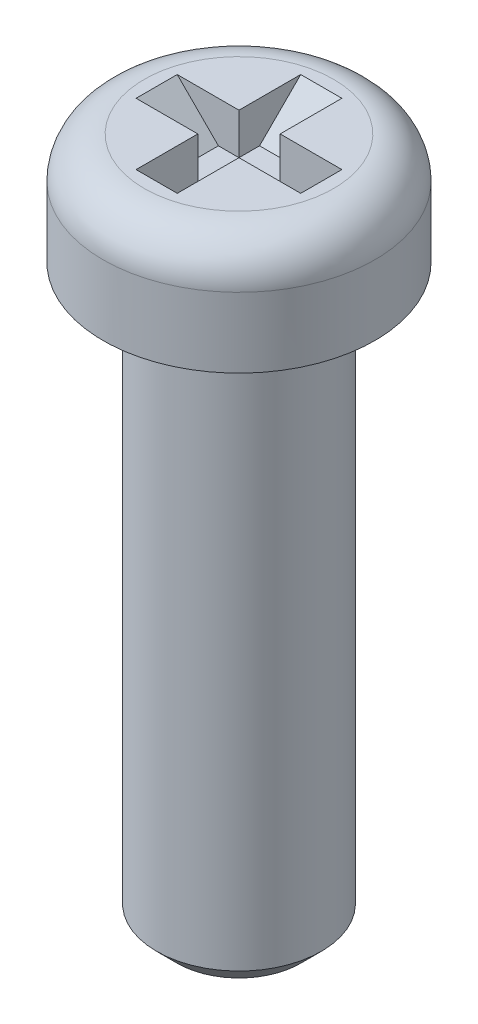
ISO-10303-21;
HEADER;
FILE_DESCRIPTION(('STEP AP214'),'2;1');
FILE_NAME('part.step','',(''),(''),'','','');
FILE_SCHEMA(('AUTOMOTIVE_DESIGN { 1 0 10303 214 1 1 1 1 }'));
ENDSEC;
DATA;
#1=APPLICATION_CONTEXT('core data for automotive mechanical design processes');
#2=APPLICATION_PROTOCOL_DEFINITION('international standard','automotive_design',2000,#1);
#3=PRODUCT_CONTEXT('',#1,'mechanical');
#4=PRODUCT('Part','Part','',(#3));
#5=PRODUCT_RELATED_PRODUCT_CATEGORY('part','',(#4));
#6=PRODUCT_DEFINITION_FORMATION('','',#4);
#7=PRODUCT_DEFINITION_CONTEXT('part definition',#1,'design');
#8=PRODUCT_DEFINITION('design','',#6,#7);
#9=PRODUCT_DEFINITION_SHAPE('','',#8);
#10=(LENGTH_UNIT() NAMED_UNIT(*) SI_UNIT(.MILLI.,.METRE.));
#11=(NAMED_UNIT(*) PLANE_ANGLE_UNIT() SI_UNIT($,.RADIAN.));
#12=(NAMED_UNIT(*) SI_UNIT($,.STERADIAN.) SOLID_ANGLE_UNIT());
#13=UNCERTAINTY_MEASURE_WITH_UNIT(LENGTH_MEASURE(1.E-05),#10,'distance_accuracy_value','');
#14=(GEOMETRIC_REPRESENTATION_CONTEXT(3) GLOBAL_UNCERTAINTY_ASSIGNED_CONTEXT((#13)) GLOBAL_UNIT_ASSIGNED_CONTEXT((#10,
#11,#12)) REPRESENTATION_CONTEXT('',''));
#15=CARTESIAN_POINT('',(0.,0.,0.));
#16=DIRECTION('',(0.,0.,1.));
#17=DIRECTION('',(1.,0.,0.));
#18=AXIS2_PLACEMENT_3D('',#15,#16,#17);
#19=CARTESIAN_POINT('',(0.,14.,0.));
#20=DIRECTION('',(0.,-1.,0.));
#21=DIRECTION('',(0.,0.,-1.));
#22=AXIS2_PLACEMENT_3D('',#19,#20,#21);
#23=CYLINDRICAL_SURFACE('',#22,2.);
#24=CARTESIAN_POINT('',(0.,0.499999999999997,0.));
#25=DIRECTION('',(0.,1.,0.));
#26=DIRECTION('',(0.,0.,1.));
#27=AXIS2_PLACEMENT_3D('',#24,#25,#26);
#28=CIRCLE('',#27,2.);
#29=CARTESIAN_POINT('',(0.,0.499999999999997,2.));
#30=VERTEX_POINT('',#29);
#31=EDGE_CURVE('E245',#30,#30,#28,.T.);
#32=ORIENTED_EDGE('',*,*,#31,.T.);
#33=EDGE_LOOP('',(#32));
#34=FACE_BOUND('',#33,.T.);
#35=CARTESIAN_POINT('',(0.,14.,0.));
#36=DIRECTION('',(0.,1.,0.));
#37=DIRECTION('',(0.,0.,1.));
#38=AXIS2_PLACEMENT_3D('',#35,#36,#37);
#39=CIRCLE('',#38,2.);
#40=CARTESIAN_POINT('',(0.,14.,2.));
#41=VERTEX_POINT('',#40);
#42=EDGE_CURVE('E231',#41,#41,#39,.T.);
#43=ORIENTED_EDGE('',*,*,#42,.F.);
#44=EDGE_LOOP('',(#43));
#45=FACE_BOUND('',#44,.T.);
#46=ADVANCED_FACE('F66',(#34,#45),#23,.T.);
#47=CARTESIAN_POINT('',(0.,0.,0.));
#48=DIRECTION('',(0.,1.,0.));
#49=DIRECTION('',(0.,0.,1.));
#50=AXIS2_PLACEMENT_3D('',#47,#48,#49);
#51=PLANE('',#50);
#52=CARTESIAN_POINT('',(0.,0.,0.));
#53=DIRECTION('',(0.,1.,0.));
#54=DIRECTION('',(0.,0.,1.));
#55=AXIS2_PLACEMENT_3D('',#52,#53,#54);
#56=CIRCLE('',#55,1.5);
#57=CARTESIAN_POINT('',(0.,0.,1.5));
#58=VERTEX_POINT('',#57);
#59=EDGE_CURVE('E244',#58,#58,#56,.F.);
#60=ORIENTED_EDGE('',*,*,#59,.T.);
#61=EDGE_LOOP('',(#60));
#62=FACE_BOUND('',#61,.T.);
#63=ADVANCED_FACE('F309',(#62),#51,.F.);
#64=CARTESIAN_POINT('',(0.,16.7,0.));
#65=DIRECTION('',(0.,-1.,0.));
#66=DIRECTION('',(0.,0.,-1.));
#67=AXIS2_PLACEMENT_3D('',#64,#65,#66);
#68=CYLINDRICAL_SURFACE('',#67,3.3);
#69=CARTESIAN_POINT('',(0.,15.7,0.));
#70=DIRECTION('',(0.,1.,0.));
#71=DIRECTION('',(0.,0.,1.));
#72=AXIS2_PLACEMENT_3D('',#69,#70,#71);
#73=CIRCLE('',#72,3.3);
#74=CARTESIAN_POINT('',(0.,15.7,-3.3));
#75=VERTEX_POINT('',#74);
#76=EDGE_CURVE('E237',#75,#75,#73,.F.);
#77=CARTESIAN_POINT('',(0.,14.,0.));
#78=DIRECTION('',(0.,1.,0.));
#79=DIRECTION('',(0.,0.,1.));
#80=AXIS2_PLACEMENT_3D('',#77,#78,#79);
#81=CIRCLE('',#80,3.3);
#82=CARTESIAN_POINT('',(0.,14.,-3.3));
#83=VERTEX_POINT('',#82);
#84=EDGE_CURVE('E220',#83,#83,#81,.T.);
#85=CARTESIAN_POINT('',(0.,15.7,-3.3));
#86=CARTESIAN_POINT('',(0.,15.6822916666667,-3.3));
#87=CARTESIAN_POINT('',(0.,15.6645833333333,-3.3));
#88=CARTESIAN_POINT('',(0.,15.6291666666667,-3.3));
#89=CARTESIAN_POINT('',(0.,15.6114583333333,-3.3));
#90=CARTESIAN_POINT('',(0.,15.5760416666667,-3.3));
#91=CARTESIAN_POINT('',(0.,15.5583333333333,-3.3));
#92=CARTESIAN_POINT('',(0.,15.5229166666667,-3.3));
#93=CARTESIAN_POINT('',(0.,15.5052083333333,-3.3));
#94=CARTESIAN_POINT('',(0.,15.4697916666667,-3.3));
#95=CARTESIAN_POINT('',(0.,15.4520833333333,-3.3));
#96=CARTESIAN_POINT('',(0.,15.4166666666667,-3.3));
#97=CARTESIAN_POINT('',(0.,15.3989583333333,-3.3));
#98=CARTESIAN_POINT('',(0.,15.3635416666667,-3.3));
#99=CARTESIAN_POINT('',(0.,15.3458333333333,-3.3));
#100=CARTESIAN_POINT('',(0.,15.3104166666667,-3.3));
#101=CARTESIAN_POINT('',(0.,15.2927083333333,-3.3));
#102=CARTESIAN_POINT('',(0.,15.2572916666667,-3.3));
#103=CARTESIAN_POINT('',(0.,15.2395833333333,-3.3));
#104=CARTESIAN_POINT('',(0.,15.2041666666667,-3.3));
#105=CARTESIAN_POINT('',(0.,15.1864583333333,-3.3));
#106=CARTESIAN_POINT('',(0.,15.1510416666667,-3.3));
#107=CARTESIAN_POINT('',(0.,15.1333333333333,-3.3));
#108=CARTESIAN_POINT('',(0.,15.0979166666667,-3.3));
#109=CARTESIAN_POINT('',(0.,15.0802083333333,-3.3));
#110=CARTESIAN_POINT('',(0.,15.0447916666667,-3.3));
#111=CARTESIAN_POINT('',(0.,15.0270833333333,-3.3));
#112=CARTESIAN_POINT('',(0.,14.9916666666667,-3.3));
#113=CARTESIAN_POINT('',(0.,14.9739583333333,-3.3));
#114=CARTESIAN_POINT('',(0.,14.9385416666667,-3.3));
#115=CARTESIAN_POINT('',(0.,14.9208333333333,-3.3));
#116=CARTESIAN_POINT('',(0.,14.8854166666667,-3.3));
#117=CARTESIAN_POINT('',(0.,14.8677083333333,-3.3));
#118=CARTESIAN_POINT('',(0.,14.8322916666667,-3.3));
#119=CARTESIAN_POINT('',(0.,14.8145833333333,-3.3));
#120=CARTESIAN_POINT('',(0.,14.7791666666667,-3.3));
#121=CARTESIAN_POINT('',(0.,14.7614583333333,-3.3));
#122=CARTESIAN_POINT('',(0.,14.7260416666667,-3.3));
#123=CARTESIAN_POINT('',(0.,14.7083333333333,-3.3));
#124=CARTESIAN_POINT('',(0.,14.6729166666667,-3.3));
#125=CARTESIAN_POINT('',(0.,14.6552083333333,-3.3));
#126=CARTESIAN_POINT('',(0.,14.6197916666667,-3.3));
#127=CARTESIAN_POINT('',(0.,14.6020833333333,-3.3));
#128=CARTESIAN_POINT('',(0.,14.5666666666667,-3.3));
#129=CARTESIAN_POINT('',(0.,14.5489583333333,-3.3));
#130=CARTESIAN_POINT('',(0.,14.5135416666667,-3.3));
#131=CARTESIAN_POINT('',(0.,14.4958333333333,-3.3));
#132=CARTESIAN_POINT('',(0.,14.4604166666667,-3.3));
#133=CARTESIAN_POINT('',(0.,14.4427083333333,-3.3));
#134=CARTESIAN_POINT('',(0.,14.4072916666667,-3.3));
#135=CARTESIAN_POINT('',(0.,14.3895833333333,-3.3));
#136=CARTESIAN_POINT('',(0.,14.3541666666667,-3.3));
#137=CARTESIAN_POINT('',(0.,14.3364583333333,-3.3));
#138=CARTESIAN_POINT('',(0.,14.3010416666667,-3.3));
#139=CARTESIAN_POINT('',(0.,14.2833333333333,-3.3));
#140=CARTESIAN_POINT('',(0.,14.2479166666667,-3.3));
#141=CARTESIAN_POINT('',(0.,14.2302083333333,-3.3));
#142=CARTESIAN_POINT('',(0.,14.1947916666667,-3.3));
#143=CARTESIAN_POINT('',(0.,14.1770833333333,-3.3));
#144=CARTESIAN_POINT('',(0.,14.1416666666667,-3.3));
#145=CARTESIAN_POINT('',(0.,14.1239583333333,-3.3));
#146=CARTESIAN_POINT('',(0.,14.0885416666667,-3.3));
#147=CARTESIAN_POINT('',(0.,14.0708333333333,-3.3));
#148=CARTESIAN_POINT('',(0.,14.0354166666667,-3.3));
#149=CARTESIAN_POINT('',(0.,14.0177083333333,-3.3));
#150=CARTESIAN_POINT('',(0.,14.,-3.3));
#151=B_SPLINE_CURVE_WITH_KNOTS('',3,(#85,#86,#87,#88,#89,#90,#91,#92,#93,#94,#95,#96,#97,#98,
#99,#100,#101,#102,#103,#104,#105,#106,#107,#108,#109,#110,#111,#112,#113,#114,#115,#116,#117,
#118,#119,#120,#121,#122,#123,#124,#125,#126,#127,#128,#129,#130,#131,#132,#133,#134,#135,#136,
#137,#138,#139,#140,#141,#142,#143,#144,#145,#146,#147,#148,#149,#150),.UNSPECIFIED.,.F.,.F.,(4,
2,2,2,2,2,2,2,2,2,2,2,2,2,2,2,2,2,2,2,2,2,2,2,2,2,2,2,2,2,2,2,4),(0.,0.0531249999999976,
0.106249999999999,0.159374999999998,0.212499999999997,0.265624999999999,0.318749999999998,
0.371874999999997,0.424999999999998,0.478124999999998,0.531249999999997,0.584374999999998,
0.637499999999997,0.690624999999997,0.743749999999998,0.796874999999997,0.849999999999997,
0.903124999999998,0.956249999999997,1.009375,1.0625,1.115625,1.16875,1.221875,1.275,1.328125,
1.38125,1.434375,1.4875,1.540625,1.59375,1.646875,1.69999999999999),.UNSPECIFIED.);
#152=EDGE_CURVE('BSEAM317',#75,#83,#151,.T.);
#153=ORIENTED_EDGE('',*,*,#76,.T.);
#154=ORIENTED_EDGE('',*,*,#84,.T.);
#155=ORIENTED_EDGE('',*,*,#152,.T.);
#156=ORIENTED_EDGE('',*,*,#152,.F.);
#157=EDGE_LOOP('',(#153,#155,#154,#156));
#158=FACE_BOUND('',#157,.T.);
#159=ADVANCED_FACE('F317',(#158),#68,.T.);
#160=CARTESIAN_POINT('',(0.,16.7,0.));
#161=DIRECTION('',(0.,1.,0.));
#162=DIRECTION('',(0.,0.,1.));
#163=AXIS2_PLACEMENT_3D('',#160,#161,#162);
#164=PLANE('',#163);
#165=DIRECTION('',(0.,0.,-1.));
#166=VECTOR('',#165,1.);
#167=CARTESIAN_POINT('',(-0.5,16.7,-2.));
#168=LINE('',#167,#166);
#169=CARTESIAN_POINT('',(-0.5,16.7,-2.));
#170=VERTEX_POINT('',#169);
#171=CARTESIAN_POINT('',(-0.5,16.7,-0.5));
#172=VERTEX_POINT('',#171);
#173=EDGE_CURVE('E190',#170,#172,#168,.F.);
#174=ORIENTED_EDGE('',*,*,#173,.F.);
#175=DIRECTION('',(1.,0.,0.));
#176=VECTOR('',#175,1.);
#177=CARTESIAN_POINT('',(-0.5,16.7,-2.));
#178=LINE('',#177,#176);
#179=CARTESIAN_POINT('',(0.5,16.7,-2.));
#180=VERTEX_POINT('',#179);
#181=EDGE_CURVE('E193',#170,#180,#178,.T.);
#182=ORIENTED_EDGE('',*,*,#181,.T.);
#183=DIRECTION('',(0.,0.,-1.));
#184=VECTOR('',#183,1.);
#185=CARTESIAN_POINT('',(0.5,16.7,-2.));
#186=LINE('',#185,#184);
#187=CARTESIAN_POINT('',(0.5,16.7,-0.5));
#188=VERTEX_POINT('',#187);
#189=EDGE_CURVE('E185',#180,#188,#186,.F.);
#190=ORIENTED_EDGE('',*,*,#189,.T.);
#191=DIRECTION('',(1.,0.,0.));
#192=VECTOR('',#191,1.);
#193=CARTESIAN_POINT('',(-2.,16.7,-0.5));
#194=LINE('',#193,#192);
#195=CARTESIAN_POINT('',(2.,16.7,-0.500000000000001));
#196=VERTEX_POINT('',#195);
#197=EDGE_CURVE('E223',#188,#196,#194,.T.);
#198=ORIENTED_EDGE('',*,*,#197,.T.);
#199=DIRECTION('',(0.,0.,1.));
#200=VECTOR('',#199,1.);
#201=CARTESIAN_POINT('',(2.,16.7,-0.500000000000001));
#202=LINE('',#201,#200);
#203=CARTESIAN_POINT('',(2.,16.7,0.499999999999999));
#204=VERTEX_POINT('',#203);
#205=EDGE_CURVE('E225',#196,#204,#202,.T.);
#206=ORIENTED_EDGE('',*,*,#205,.T.);
#207=DIRECTION('',(1.,0.,0.));
#208=VECTOR('',#207,1.);
#209=CARTESIAN_POINT('',(-2.,16.7,0.5));
#210=LINE('',#209,#208);
#211=CARTESIAN_POINT('',(0.5,16.7,0.5));
#212=VERTEX_POINT('',#211);
#213=EDGE_CURVE('E181',#212,#204,#210,.T.);
#214=ORIENTED_EDGE('',*,*,#213,.F.);
#215=CARTESIAN_POINT('',(0.5,16.7,2.));
#216=VERTEX_POINT('',#215);
#217=EDGE_CURVE('E162',#212,#216,#186,.F.);
#218=ORIENTED_EDGE('',*,*,#217,.T.);
#219=DIRECTION('',(-1.,0.,0.));
#220=VECTOR('',#219,1.);
#221=CARTESIAN_POINT('',(0.5,16.7,2.));
#222=LINE('',#221,#220);
#223=CARTESIAN_POINT('',(-0.5,16.7,2.));
#224=VERTEX_POINT('',#223);
#225=EDGE_CURVE('E178',#216,#224,#222,.T.);
#226=ORIENTED_EDGE('',*,*,#225,.T.);
#227=CARTESIAN_POINT('',(-0.5,16.7,0.5));
#228=VERTEX_POINT('',#227);
#229=EDGE_CURVE('E188',#228,#224,#168,.F.);
#230=ORIENTED_EDGE('',*,*,#229,.F.);
#231=CARTESIAN_POINT('',(-2.,16.7,0.5));
#232=VERTEX_POINT('',#231);
#233=EDGE_CURVE('E216',#232,#228,#210,.T.);
#234=ORIENTED_EDGE('',*,*,#233,.F.);
#235=DIRECTION('',(0.,0.,-1.));
#236=VECTOR('',#235,1.);
#237=CARTESIAN_POINT('',(-2.,16.7,0.5));
#238=LINE('',#237,#236);
#239=CARTESIAN_POINT('',(-2.,16.7,-0.5));
#240=VERTEX_POINT('',#239);
#241=EDGE_CURVE('E226',#232,#240,#238,.T.);
#242=ORIENTED_EDGE('',*,*,#241,.T.);
#243=EDGE_CURVE('E224',#240,#172,#194,.T.);
#244=ORIENTED_EDGE('',*,*,#243,.T.);
#245=EDGE_LOOP('',(#174,#182,#190,#198,#206,#214,#218,#226,#230,#234,#242,#244));
#246=FACE_BOUND('',#245,.T.);
#247=CARTESIAN_POINT('',(0.,16.7,0.));
#248=DIRECTION('',(0.,1.,0.));
#249=DIRECTION('',(0.,0.,1.));
#250=AXIS2_PLACEMENT_3D('',#247,#248,#249);
#251=CIRCLE('',#250,2.3);
#252=CARTESIAN_POINT('',(0.,16.7,2.3));
#253=VERTEX_POINT('',#252);
#254=EDGE_CURVE('E236',#253,#253,#251,.T.);
#255=ORIENTED_EDGE('',*,*,#254,.T.);
#256=EDGE_LOOP('',(#255));
#257=FACE_BOUND('',#256,.T.);
#258=ADVANCED_FACE('F174',(#246,#257),#164,.T.);
#259=CARTESIAN_POINT('',(0.,14.,0.));
#260=DIRECTION('',(0.,1.,0.));
#261=DIRECTION('',(0.,0.,1.));
#262=AXIS2_PLACEMENT_3D('',#259,#260,#261);
#263=PLANE('',#262);
#264=ORIENTED_EDGE('',*,*,#42,.T.);
#265=EDGE_LOOP('',(#264));
#266=FACE_BOUND('',#265,.T.);
#267=ORIENTED_EDGE('',*,*,#84,.F.);
#268=EDGE_LOOP('',(#267));
#269=FACE_BOUND('',#268,.T.);
#270=ADVANCED_FACE('F324',(#266,#269),#263,.F.);
#271=CARTESIAN_POINT('',(0.,15.7,0.));
#272=DIRECTION('',(0.,1.,0.));
#273=DIRECTION('',(0.,0.,1.));
#274=AXIS2_PLACEMENT_3D('',#271,#272,#273);
#275=TOROIDAL_SURFACE('',#274,2.3,1.);
#276=ORIENTED_EDGE('',*,*,#76,.F.);
#277=EDGE_LOOP('',(#276));
#278=FACE_BOUND('',#277,.T.);
#279=ORIENTED_EDGE('',*,*,#254,.F.);
#280=EDGE_LOOP('',(#279));
#281=FACE_BOUND('',#280,.T.);
#282=ADVANCED_FACE('F302',(#278,#281),#275,.T.);
#283=CARTESIAN_POINT('',(0.,0.499999999999997,0.));
#284=DIRECTION('',(0.,1.,0.));
#285=DIRECTION('',(0.,0.,1.));
#286=AXIS2_PLACEMENT_3D('',#283,#284,#285);
#287=CONICAL_SURFACE('',#286,2.,0.78539816339745);
#288=ORIENTED_EDGE('',*,*,#59,.F.);
#289=EDGE_LOOP('',(#288));
#290=FACE_BOUND('',#289,.T.);
#291=ORIENTED_EDGE('',*,*,#31,.F.);
#292=EDGE_LOOP('',(#291));
#293=FACE_BOUND('',#292,.T.);
#294=ADVANCED_FACE('F298',(#290,#293),#287,.T.);
#295=CARTESIAN_POINT('',(-2.,15.7,0.5));
#296=DIRECTION('',(0.,0.,1.));
#297=DIRECTION('',(1.,0.,0.));
#298=AXIS2_PLACEMENT_3D('',#295,#296,#297);
#299=PLANE('',#298);
#300=ORIENTED_EDGE('',*,*,#213,.T.);
#301=DIRECTION('',(-0.707106781186544,-0.707106781186551,0.));
#302=VECTOR('',#301,1.);
#303=CARTESIAN_POINT('',(2.,16.7,0.499999999999999));
#304=LINE('',#303,#302);
#305=CARTESIAN_POINT('',(1.,15.7,0.5));
#306=VERTEX_POINT('',#305);
#307=EDGE_CURVE('E166',#204,#306,#304,.T.);
#308=ORIENTED_EDGE('',*,*,#307,.T.);
#309=DIRECTION('',(1.,0.,0.));
#310=VECTOR('',#309,1.);
#311=CARTESIAN_POINT('',(-2.,15.7,0.5));
#312=LINE('',#311,#310);
#313=CARTESIAN_POINT('',(0.5,15.7,0.5));
#314=VERTEX_POINT('',#313);
#315=EDGE_CURVE('E211',#314,#306,#312,.T.);
#316=ORIENTED_EDGE('',*,*,#315,.F.);
#317=DIRECTION('',(0.,-1.,0.));
#318=VECTOR('',#317,1.);
#319=CARTESIAN_POINT('',(0.5,15.7,0.5));
#320=LINE('',#319,#318);
#321=EDGE_CURVE('E205',#212,#314,#320,.T.);
#322=ORIENTED_EDGE('',*,*,#321,.F.);
#323=EDGE_LOOP('',(#300,#308,#316,#322));
#324=FACE_BOUND('',#323,.T.);
#325=ADVANCED_FACE('F295',(#324),#299,.F.);
#326=CARTESIAN_POINT('',(-2.,15.7,-0.5));
#327=DIRECTION('',(0.,0.,1.));
#328=DIRECTION('',(1.,0.,0.));
#329=AXIS2_PLACEMENT_3D('',#326,#327,#328);
#330=PLANE('',#329);
#331=DIRECTION('',(1.,0.,0.));
#332=VECTOR('',#331,1.);
#333=CARTESIAN_POINT('',(-2.,15.7,-0.5));
#334=LINE('',#333,#332);
#335=CARTESIAN_POINT('',(0.5,15.7,-0.5));
#336=VERTEX_POINT('',#335);
#337=CARTESIAN_POINT('',(1.,15.7,-0.5));
#338=VERTEX_POINT('',#337);
#339=EDGE_CURVE('E214',#336,#338,#334,.T.);
#340=ORIENTED_EDGE('',*,*,#339,.T.);
#341=DIRECTION('',(0.707106781186544,0.707106781186551,0.));
#342=VECTOR('',#341,1.);
#343=CARTESIAN_POINT('',(-0.499999999999987,14.2,-0.5));
#344=LINE('',#343,#342);
#345=EDGE_CURVE('E257',#338,#196,#344,.T.);
#346=ORIENTED_EDGE('',*,*,#345,.T.);
#347=ORIENTED_EDGE('',*,*,#197,.F.);
#348=DIRECTION('',(0.,-1.,0.));
#349=VECTOR('',#348,1.);
#350=CARTESIAN_POINT('',(0.5,15.7,-0.5));
#351=LINE('',#350,#349);
#352=EDGE_CURVE('E196',#188,#336,#351,.T.);
#353=ORIENTED_EDGE('',*,*,#352,.T.);
#354=EDGE_LOOP('',(#340,#346,#347,#353));
#355=FACE_BOUND('',#354,.T.);
#356=ADVANCED_FACE('F290',(#355),#330,.T.);
#357=CARTESIAN_POINT('',(-1.,15.7,0.5));
#358=VERTEX_POINT('',#357);
#359=CARTESIAN_POINT('',(-0.5,15.7,0.5));
#360=VERTEX_POINT('',#359);
#361=EDGE_CURVE('E212',#358,#360,#312,.T.);
#362=ORIENTED_EDGE('',*,*,#361,.F.);
#363=DIRECTION('',(-0.707106781186544,0.707106781186551,0.));
#364=VECTOR('',#363,1.);
#365=CARTESIAN_POINT('',(-2.,16.7,0.5));
#366=LINE('',#365,#364);
#367=EDGE_CURVE('E12',#358,#232,#366,.T.);
#368=ORIENTED_EDGE('',*,*,#367,.T.);
#369=ORIENTED_EDGE('',*,*,#233,.T.);
#370=DIRECTION('',(0.,-1.,0.));
#371=VECTOR('',#370,1.);
#372=CARTESIAN_POINT('',(-0.5,15.7,0.5));
#373=LINE('',#372,#371);
#374=EDGE_CURVE('E206',#228,#360,#373,.T.);
#375=ORIENTED_EDGE('',*,*,#374,.T.);
#376=EDGE_LOOP('',(#362,#368,#369,#375));
#377=FACE_BOUND('',#376,.T.);
#378=ADVANCED_FACE('F274',(#377),#299,.F.);
#379=ORIENTED_EDGE('',*,*,#243,.F.);
#380=DIRECTION('',(0.707106781186544,-0.707106781186551,0.));
#381=VECTOR('',#380,1.);
#382=CARTESIAN_POINT('',(-1.5,16.2,-0.5));
#383=LINE('',#382,#381);
#384=CARTESIAN_POINT('',(-1.,15.7,-0.5));
#385=VERTEX_POINT('',#384);
#386=EDGE_CURVE('E76',#240,#385,#383,.T.);
#387=ORIENTED_EDGE('',*,*,#386,.T.);
#388=CARTESIAN_POINT('',(-0.5,15.7,-0.5));
#389=VERTEX_POINT('',#388);
#390=EDGE_CURVE('E213',#385,#389,#334,.T.);
#391=ORIENTED_EDGE('',*,*,#390,.T.);
#392=DIRECTION('',(0.,-1.,0.));
#393=VECTOR('',#392,1.);
#394=CARTESIAN_POINT('',(-0.5,15.7,-0.5));
#395=LINE('',#394,#393);
#396=EDGE_CURVE('E204',#172,#389,#395,.T.);
#397=ORIENTED_EDGE('',*,*,#396,.F.);
#398=EDGE_LOOP('',(#379,#387,#391,#397));
#399=FACE_BOUND('',#398,.T.);
#400=ADVANCED_FACE('F265',(#399),#330,.T.);
#401=CARTESIAN_POINT('',(0.,15.7,0.));
#402=DIRECTION('',(0.,-1.,0.));
#403=DIRECTION('',(-1.,0.,0.));
#404=AXIS2_PLACEMENT_3D('',#401,#402,#403);
#405=PLANE('',#404);
#406=DIRECTION('',(0.,0.,-1.));
#407=VECTOR('',#406,1.);
#408=CARTESIAN_POINT('',(-0.5,15.7,-2.));
#409=LINE('',#408,#407);
#410=CARTESIAN_POINT('',(-0.5,15.7,1.));
#411=VERTEX_POINT('',#410);
#412=EDGE_CURVE('E200',#360,#411,#409,.F.);
#413=ORIENTED_EDGE('',*,*,#412,.T.);
#414=DIRECTION('',(1.,0.,0.));
#415=VECTOR('',#414,1.);
#416=CARTESIAN_POINT('',(0.,15.7,1.));
#417=LINE('',#416,#415);
#418=CARTESIAN_POINT('',(0.5,15.7,1.));
#419=VERTEX_POINT('',#418);
#420=EDGE_CURVE('E169',#411,#419,#417,.T.);
#421=ORIENTED_EDGE('',*,*,#420,.T.);
#422=DIRECTION('',(0.,0.,-1.));
#423=VECTOR('',#422,1.);
#424=CARTESIAN_POINT('',(0.5,15.7,-2.));
#425=LINE('',#424,#423);
#426=EDGE_CURVE('E165',#314,#419,#425,.F.);
#427=ORIENTED_EDGE('',*,*,#426,.F.);
#428=ORIENTED_EDGE('',*,*,#315,.T.);
#429=DIRECTION('',(0.,0.,-1.));
#430=VECTOR('',#429,1.);
#431=CARTESIAN_POINT('',(1.,15.7,0.));
#432=LINE('',#431,#430);
#433=EDGE_CURVE('E255',#306,#338,#432,.T.);
#434=ORIENTED_EDGE('',*,*,#433,.T.);
#435=ORIENTED_EDGE('',*,*,#339,.F.);
#436=CARTESIAN_POINT('',(0.5,15.7,-1.));
#437=VERTEX_POINT('',#436);
#438=EDGE_CURVE('E202',#437,#336,#425,.F.);
#439=ORIENTED_EDGE('',*,*,#438,.F.);
#440=DIRECTION('',(-1.,0.,0.));
#441=VECTOR('',#440,1.);
#442=CARTESIAN_POINT('',(0.,15.7,-1.));
#443=LINE('',#442,#441);
#444=CARTESIAN_POINT('',(-0.5,15.7,-1.));
#445=VERTEX_POINT('',#444);
#446=EDGE_CURVE('E83',#437,#445,#443,.T.);
#447=ORIENTED_EDGE('',*,*,#446,.T.);
#448=EDGE_CURVE('E269',#445,#389,#409,.F.);
#449=ORIENTED_EDGE('',*,*,#448,.T.);
#450=ORIENTED_EDGE('',*,*,#390,.F.);
#451=DIRECTION('',(0.,0.,1.));
#452=VECTOR('',#451,1.);
#453=CARTESIAN_POINT('',(-1.,15.7,0.));
#454=LINE('',#453,#452);
#455=EDGE_CURVE('E248',#385,#358,#454,.T.);
#456=ORIENTED_EDGE('',*,*,#455,.T.);
#457=ORIENTED_EDGE('',*,*,#361,.T.);
#458=EDGE_LOOP('',(#413,#421,#427,#428,#434,#435,#439,#447,#449,#450,#456,#457));
#459=FACE_BOUND('',#458,.T.);
#460=ADVANCED_FACE('F267',(#459),#405,.F.);
#461=CARTESIAN_POINT('',(0.5,15.7,-2.));
#462=DIRECTION('',(-1.,0.,0.));
#463=DIRECTION('',(0.,0.,1.));
#464=AXIS2_PLACEMENT_3D('',#461,#462,#463);
#465=PLANE('',#464);
#466=ORIENTED_EDGE('',*,*,#189,.F.);
#467=DIRECTION('',(0.,-0.707106781186551,0.707106781186544));
#468=VECTOR('',#467,1.);
#469=CARTESIAN_POINT('',(0.5,16.2,-1.5));
#470=LINE('',#469,#468);
#471=EDGE_CURVE('E92',#180,#437,#470,.T.);
#472=ORIENTED_EDGE('',*,*,#471,.T.);
#473=ORIENTED_EDGE('',*,*,#438,.T.);
#474=ORIENTED_EDGE('',*,*,#352,.F.);
#475=EDGE_LOOP('',(#466,#472,#473,#474));
#476=FACE_BOUND('',#475,.T.);
#477=ADVANCED_FACE('F282',(#476),#465,.T.);
#478=CARTESIAN_POINT('',(-0.5,15.7,-2.));
#479=DIRECTION('',(-1.,0.,0.));
#480=DIRECTION('',(0.,0.,1.));
#481=AXIS2_PLACEMENT_3D('',#478,#479,#480);
#482=PLANE('',#481);
#483=ORIENTED_EDGE('',*,*,#448,.F.);
#484=DIRECTION('',(0.,0.707106781186551,-0.707106781186544));
#485=VECTOR('',#484,1.);
#486=CARTESIAN_POINT('',(-0.5,16.7,-2.));
#487=LINE('',#486,#485);
#488=EDGE_CURVE('E256',#445,#170,#487,.T.);
#489=ORIENTED_EDGE('',*,*,#488,.T.);
#490=ORIENTED_EDGE('',*,*,#173,.T.);
#491=ORIENTED_EDGE('',*,*,#396,.T.);
#492=EDGE_LOOP('',(#483,#489,#490,#491));
#493=FACE_BOUND('',#492,.T.);
#494=ADVANCED_FACE('F348',(#493),#482,.F.);
#495=ORIENTED_EDGE('',*,*,#229,.T.);
#496=DIRECTION('',(0.,-0.707106781186551,-0.707106781186544));
#497=VECTOR('',#496,1.);
#498=CARTESIAN_POINT('',(-0.5,16.7,2.));
#499=LINE('',#498,#497);
#500=EDGE_CURVE('E184',#224,#411,#499,.T.);
#501=ORIENTED_EDGE('',*,*,#500,.T.);
#502=ORIENTED_EDGE('',*,*,#412,.F.);
#503=ORIENTED_EDGE('',*,*,#374,.F.);
#504=EDGE_LOOP('',(#495,#501,#502,#503));
#505=FACE_BOUND('',#504,.T.);
#506=ADVANCED_FACE('F277',(#505),#482,.F.);
#507=ORIENTED_EDGE('',*,*,#426,.T.);
#508=DIRECTION('',(0.,0.707106781186551,0.707106781186544));
#509=VECTOR('',#508,1.);
#510=CARTESIAN_POINT('',(0.5,14.2,-0.499999999999987));
#511=LINE('',#510,#509);
#512=EDGE_CURVE('E157',#419,#216,#511,.T.);
#513=ORIENTED_EDGE('',*,*,#512,.T.);
#514=ORIENTED_EDGE('',*,*,#217,.F.);
#515=ORIENTED_EDGE('',*,*,#321,.T.);
#516=EDGE_LOOP('',(#507,#513,#514,#515));
#517=FACE_BOUND('',#516,.T.);
#518=ADVANCED_FACE('F159',(#517),#465,.T.);
#519=CARTESIAN_POINT('',(0.5,16.7,2.));
#520=DIRECTION('',(0.,-0.707106781186544,0.707106781186551));
#521=DIRECTION('',(-1.,0.,0.));
#522=AXIS2_PLACEMENT_3D('',#519,#520,#521);
#523=PLANE('',#522);
#524=ORIENTED_EDGE('',*,*,#512,.F.);
#525=ORIENTED_EDGE('',*,*,#420,.F.);
#526=ORIENTED_EDGE('',*,*,#500,.F.);
#527=ORIENTED_EDGE('',*,*,#225,.F.);
#528=EDGE_LOOP('',(#524,#525,#526,#527));
#529=FACE_BOUND('',#528,.T.);
#530=ADVANCED_FACE('F183',(#529),#523,.F.);
#531=CARTESIAN_POINT('',(2.,16.7,-0.500000000000001));
#532=DIRECTION('',(0.707106781186551,-0.707106781186544,0.));
#533=DIRECTION('',(0.,0.,1.));
#534=AXIS2_PLACEMENT_3D('',#531,#532,#533);
#535=PLANE('',#534);
#536=ORIENTED_EDGE('',*,*,#345,.F.);
#537=ORIENTED_EDGE('',*,*,#433,.F.);
#538=ORIENTED_EDGE('',*,*,#307,.F.);
#539=ORIENTED_EDGE('',*,*,#205,.F.);
#540=EDGE_LOOP('',(#536,#537,#538,#539));
#541=FACE_BOUND('',#540,.T.);
#542=ADVANCED_FACE('F293',(#541),#535,.F.);
#543=CARTESIAN_POINT('',(-0.5,16.7,-2.));
#544=DIRECTION('',(0.,-0.707106781186544,-0.707106781186551));
#545=DIRECTION('',(1.,0.,0.));
#546=AXIS2_PLACEMENT_3D('',#543,#544,#545);
#547=PLANE('',#546);
#548=ORIENTED_EDGE('',*,*,#488,.F.);
#549=ORIENTED_EDGE('',*,*,#446,.F.);
#550=ORIENTED_EDGE('',*,*,#471,.F.);
#551=ORIENTED_EDGE('',*,*,#181,.F.);
#552=EDGE_LOOP('',(#548,#549,#550,#551));
#553=FACE_BOUND('',#552,.T.);
#554=ADVANCED_FACE('F339',(#553),#547,.F.);
#555=CARTESIAN_POINT('',(-2.,16.7,0.5));
#556=DIRECTION('',(-0.707106781186551,-0.707106781186544,0.));
#557=DIRECTION('',(0.,0.,-1.));
#558=AXIS2_PLACEMENT_3D('',#555,#556,#557);
#559=PLANE('',#558);
#560=ORIENTED_EDGE('',*,*,#367,.F.);
#561=ORIENTED_EDGE('',*,*,#455,.F.);
#562=ORIENTED_EDGE('',*,*,#386,.F.);
#563=ORIENTED_EDGE('',*,*,#241,.F.);
#564=EDGE_LOOP('',(#560,#561,#562,#563));
#565=FACE_BOUND('',#564,.T.);
#566=ADVANCED_FACE('F75',(#565),#559,.F.);
#567=CLOSED_SHELL('',(#46,#63,#159,#258,#270,#282,#294,#325,#356,#378,#400,#460,#477,#494,#506,
#518,#530,#542,#554,#566));
#568=MANIFOLD_SOLID_BREP('B2',#567);
#569=ADVANCED_BREP_SHAPE_REPRESENTATION('',(#18,#568),#14);
#570=SHAPE_DEFINITION_REPRESENTATION(#9,#569);
ENDSEC;
END-ISO-10303-21;
